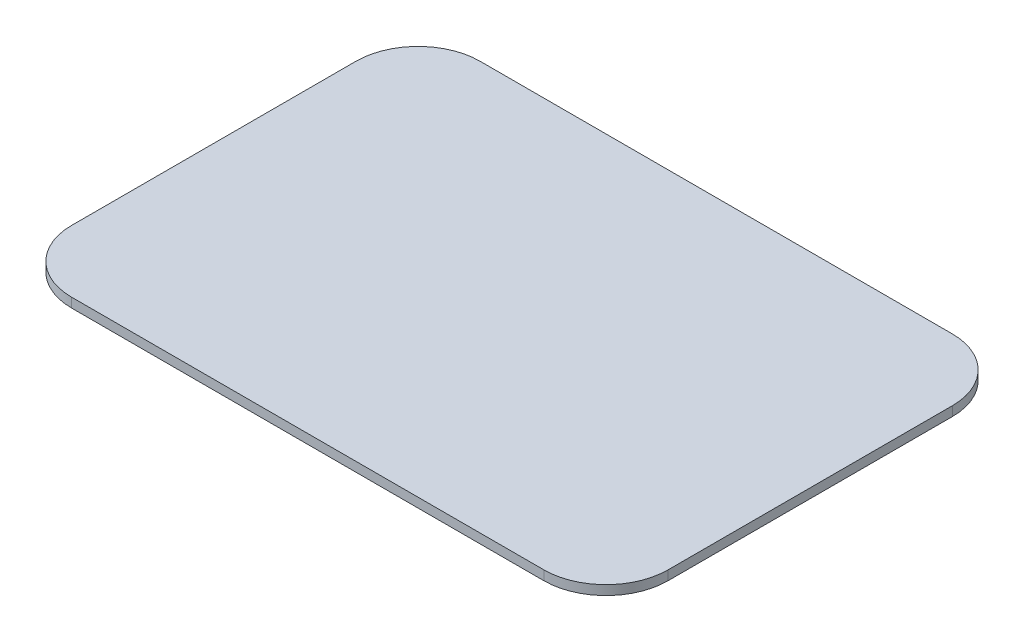
ISO-10303-21;
HEADER;
FILE_DESCRIPTION(('STEP AP214'),'2;1');
FILE_NAME('part.step','',(''),(''),'','','');
FILE_SCHEMA(('AUTOMOTIVE_DESIGN { 1 0 10303 214 1 1 1 1 }'));
ENDSEC;
DATA;
#1=APPLICATION_CONTEXT('core data for automotive mechanical design processes');
#2=APPLICATION_PROTOCOL_DEFINITION('international standard','automotive_design',2000,#1);
#3=PRODUCT_CONTEXT('',#1,'mechanical');
#4=PRODUCT('Part','Part','',(#3));
#5=PRODUCT_RELATED_PRODUCT_CATEGORY('part','',(#4));
#6=PRODUCT_DEFINITION_FORMATION('','',#4);
#7=PRODUCT_DEFINITION_CONTEXT('part definition',#1,'design');
#8=PRODUCT_DEFINITION('design','',#6,#7);
#9=PRODUCT_DEFINITION_SHAPE('','',#8);
#10=(LENGTH_UNIT() NAMED_UNIT(*) SI_UNIT(.MILLI.,.METRE.));
#11=(NAMED_UNIT(*) PLANE_ANGLE_UNIT() SI_UNIT($,.RADIAN.));
#12=(NAMED_UNIT(*) SI_UNIT($,.STERADIAN.) SOLID_ANGLE_UNIT());
#13=UNCERTAINTY_MEASURE_WITH_UNIT(LENGTH_MEASURE(1.E-05),#10,'distance_accuracy_value','');
#14=(GEOMETRIC_REPRESENTATION_CONTEXT(3) GLOBAL_UNCERTAINTY_ASSIGNED_CONTEXT((#13)) GLOBAL_UNIT_ASSIGNED_CONTEXT((#10,
#11,#12)) REPRESENTATION_CONTEXT('',''));
#15=CARTESIAN_POINT('',(0.,0.,0.));
#16=DIRECTION('',(0.,0.,1.));
#17=DIRECTION('',(1.,0.,0.));
#18=AXIS2_PLACEMENT_3D('',#15,#16,#17);
#19=CARTESIAN_POINT('',(-50.,2.,-30.1023013459279));
#20=DIRECTION('',(0.,-1.,0.));
#21=DIRECTION('',(0.,0.,-1.));
#22=AXIS2_PLACEMENT_3D('',#19,#20,#21);
#23=CYLINDRICAL_SURFACE('',#22,13.15);
#24=CARTESIAN_POINT('',(-50.,0.,-30.1023013459279));
#25=DIRECTION('',(0.,1.,0.));
#26=DIRECTION('',(0.,0.,1.));
#27=AXIS2_PLACEMENT_3D('',#24,#25,#26);
#28=CIRCLE('',#27,13.15);
#29=CARTESIAN_POINT('',(-50.,0.,-43.2523013459279));
#30=VERTEX_POINT('',#29);
#31=CARTESIAN_POINT('',(-63.15,0.,-30.1023013459279));
#32=VERTEX_POINT('',#31);
#33=EDGE_CURVE('E140',#30,#32,#28,.T.);
#34=ORIENTED_EDGE('',*,*,#33,.T.);
#35=DIRECTION('',(0.,-1.,0.));
#36=VECTOR('',#35,1.);
#37=CARTESIAN_POINT('',(-63.15,2.,-30.1023013459279));
#38=LINE('',#37,#36);
#39=CARTESIAN_POINT('',(-63.15,2.,-30.1023013459279));
#40=VERTEX_POINT('',#39);
#41=EDGE_CURVE('E11',#40,#32,#38,.T.);
#42=ORIENTED_EDGE('',*,*,#41,.F.);
#43=CARTESIAN_POINT('',(-50.,2.,-30.1023013459279));
#44=DIRECTION('',(0.,1.,0.));
#45=DIRECTION('',(0.,0.,1.));
#46=AXIS2_PLACEMENT_3D('',#43,#44,#45);
#47=CIRCLE('',#46,13.15);
#48=CARTESIAN_POINT('',(-50.,2.,-43.2523013459279));
#49=VERTEX_POINT('',#48);
#50=EDGE_CURVE('E162',#49,#40,#47,.T.);
#51=ORIENTED_EDGE('',*,*,#50,.F.);
#52=DIRECTION('',(0.,-1.,0.));
#53=VECTOR('',#52,1.);
#54=CARTESIAN_POINT('',(-50.,2.,-43.2523013459279));
#55=LINE('',#54,#53);
#56=EDGE_CURVE('E136',#49,#30,#55,.T.);
#57=ORIENTED_EDGE('',*,*,#56,.T.);
#58=EDGE_LOOP('',(#34,#42,#51,#57));
#59=FACE_BOUND('',#58,.T.);
#60=ADVANCED_FACE('F39',(#59),#23,.T.);
#61=CARTESIAN_POINT('',(-63.15,2.,-30.1023013459279));
#62=DIRECTION('',(1.,0.,0.));
#63=DIRECTION('',(0.,0.,-1.));
#64=AXIS2_PLACEMENT_3D('',#61,#62,#63);
#65=PLANE('',#64);
#66=DIRECTION('',(0.,0.,1.));
#67=VECTOR('',#66,1.);
#68=CARTESIAN_POINT('',(-63.15,0.,-30.1023013459279));
#69=LINE('',#68,#67);
#70=CARTESIAN_POINT('',(-63.15,0.,30.1023013459279));
#71=VERTEX_POINT('',#70);
#72=EDGE_CURVE('E144',#32,#71,#69,.T.);
#73=ORIENTED_EDGE('',*,*,#72,.T.);
#74=DIRECTION('',(0.,-1.,0.));
#75=VECTOR('',#74,1.);
#76=CARTESIAN_POINT('',(-63.15,2.,30.1023013459279));
#77=LINE('',#76,#75);
#78=CARTESIAN_POINT('',(-63.15,2.,30.1023013459279));
#79=VERTEX_POINT('',#78);
#80=EDGE_CURVE('E48',#79,#71,#77,.T.);
#81=ORIENTED_EDGE('',*,*,#80,.F.);
#82=DIRECTION('',(0.,0.,1.));
#83=VECTOR('',#82,1.);
#84=CARTESIAN_POINT('',(-63.15,2.,-30.1023013459279));
#85=LINE('',#84,#83);
#86=EDGE_CURVE('E99',#40,#79,#85,.T.);
#87=ORIENTED_EDGE('',*,*,#86,.F.);
#88=ORIENTED_EDGE('',*,*,#41,.T.);
#89=EDGE_LOOP('',(#73,#81,#87,#88));
#90=FACE_BOUND('',#89,.T.);
#91=ADVANCED_FACE('F208',(#90),#65,.F.);
#92=CARTESIAN_POINT('',(-50.,2.,30.1023013459279));
#93=DIRECTION('',(0.,-1.,0.));
#94=DIRECTION('',(0.,0.,-1.));
#95=AXIS2_PLACEMENT_3D('',#92,#93,#94);
#96=CYLINDRICAL_SURFACE('',#95,13.15);
#97=CARTESIAN_POINT('',(-50.,0.,30.1023013459279));
#98=DIRECTION('',(0.,1.,0.));
#99=DIRECTION('',(0.,0.,-1.));
#100=AXIS2_PLACEMENT_3D('',#97,#98,#99);
#101=CIRCLE('',#100,13.15);
#102=CARTESIAN_POINT('',(-50.,0.,43.2523013459279));
#103=VERTEX_POINT('',#102);
#104=EDGE_CURVE('E147',#71,#103,#101,.T.);
#105=ORIENTED_EDGE('',*,*,#104,.T.);
#106=DIRECTION('',(0.,-1.,0.));
#107=VECTOR('',#106,1.);
#108=CARTESIAN_POINT('',(-50.,2.,43.2523013459279));
#109=LINE('',#108,#107);
#110=CARTESIAN_POINT('',(-50.,2.,43.2523013459279));
#111=VERTEX_POINT('',#110);
#112=EDGE_CURVE('E173',#111,#103,#109,.T.);
#113=ORIENTED_EDGE('',*,*,#112,.F.);
#114=CARTESIAN_POINT('',(-50.,2.,30.1023013459279));
#115=DIRECTION('',(0.,1.,0.));
#116=DIRECTION('',(0.,0.,-1.));
#117=AXIS2_PLACEMENT_3D('',#114,#115,#116);
#118=CIRCLE('',#117,13.15);
#119=EDGE_CURVE('E183',#79,#111,#118,.T.);
#120=ORIENTED_EDGE('',*,*,#119,.F.);
#121=ORIENTED_EDGE('',*,*,#80,.T.);
#122=EDGE_LOOP('',(#105,#113,#120,#121));
#123=FACE_BOUND('',#122,.T.);
#124=ADVANCED_FACE('F181',(#123),#96,.T.);
#125=CARTESIAN_POINT('',(-50.,2.,43.2523013459279));
#126=DIRECTION('',(0.,0.,-1.));
#127=DIRECTION('',(-1.,0.,0.));
#128=AXIS2_PLACEMENT_3D('',#125,#126,#127);
#129=PLANE('',#128);
#130=DIRECTION('',(1.,0.,0.));
#131=VECTOR('',#130,1.);
#132=CARTESIAN_POINT('',(-50.,0.,43.2523013459279));
#133=LINE('',#132,#131);
#134=CARTESIAN_POINT('',(50.,0.,43.2523013459279));
#135=VERTEX_POINT('',#134);
#136=EDGE_CURVE('E150',#103,#135,#133,.T.);
#137=ORIENTED_EDGE('',*,*,#136,.T.);
#138=DIRECTION('',(0.,-1.,0.));
#139=VECTOR('',#138,1.);
#140=CARTESIAN_POINT('',(50.,2.,43.2523013459279));
#141=LINE('',#140,#139);
#142=CARTESIAN_POINT('',(50.,2.,43.2523013459279));
#143=VERTEX_POINT('',#142);
#144=EDGE_CURVE('E169',#143,#135,#141,.T.);
#145=ORIENTED_EDGE('',*,*,#144,.F.);
#146=DIRECTION('',(1.,0.,0.));
#147=VECTOR('',#146,1.);
#148=CARTESIAN_POINT('',(-50.,2.,43.2523013459279));
#149=LINE('',#148,#147);
#150=EDGE_CURVE('E196',#111,#143,#149,.T.);
#151=ORIENTED_EDGE('',*,*,#150,.F.);
#152=ORIENTED_EDGE('',*,*,#112,.T.);
#153=EDGE_LOOP('',(#137,#145,#151,#152));
#154=FACE_BOUND('',#153,.T.);
#155=ADVANCED_FACE('F191',(#154),#129,.F.);
#156=CARTESIAN_POINT('',(50.,2.,30.1023013459279));
#157=DIRECTION('',(0.,-1.,0.));
#158=DIRECTION('',(0.,0.,-1.));
#159=AXIS2_PLACEMENT_3D('',#156,#157,#158);
#160=CYLINDRICAL_SURFACE('',#159,13.15);
#161=CARTESIAN_POINT('',(50.,0.,30.1023013459279));
#162=DIRECTION('',(0.,1.,0.));
#163=DIRECTION('',(0.,0.,1.));
#164=AXIS2_PLACEMENT_3D('',#161,#162,#163);
#165=CIRCLE('',#164,13.15);
#166=CARTESIAN_POINT('',(63.15,0.,30.1023013459279));
#167=VERTEX_POINT('',#166);
#168=EDGE_CURVE('E153',#135,#167,#165,.T.);
#169=ORIENTED_EDGE('',*,*,#168,.T.);
#170=DIRECTION('',(0.,-1.,0.));
#171=VECTOR('',#170,1.);
#172=CARTESIAN_POINT('',(63.15,2.,30.1023013459279));
#173=LINE('',#172,#171);
#174=CARTESIAN_POINT('',(63.15,2.,30.1023013459279));
#175=VERTEX_POINT('',#174);
#176=EDGE_CURVE('E129',#175,#167,#173,.T.);
#177=ORIENTED_EDGE('',*,*,#176,.F.);
#178=CARTESIAN_POINT('',(50.,2.,30.1023013459279));
#179=DIRECTION('',(0.,1.,0.));
#180=DIRECTION('',(0.,0.,1.));
#181=AXIS2_PLACEMENT_3D('',#178,#179,#180);
#182=CIRCLE('',#181,13.15);
#183=EDGE_CURVE('E118',#143,#175,#182,.T.);
#184=ORIENTED_EDGE('',*,*,#183,.F.);
#185=ORIENTED_EDGE('',*,*,#144,.T.);
#186=EDGE_LOOP('',(#169,#177,#184,#185));
#187=FACE_BOUND('',#186,.T.);
#188=ADVANCED_FACE('F194',(#187),#160,.T.);
#189=CARTESIAN_POINT('',(63.15,2.,-30.1023013459279));
#190=DIRECTION('',(-1.,0.,0.));
#191=DIRECTION('',(0.,0.,1.));
#192=AXIS2_PLACEMENT_3D('',#189,#190,#191);
#193=PLANE('',#192);
#194=DIRECTION('',(0.,0.,-1.));
#195=VECTOR('',#194,1.);
#196=CARTESIAN_POINT('',(63.15,0.,-30.1023013459279));
#197=LINE('',#196,#195);
#198=CARTESIAN_POINT('',(63.15,0.,-30.1023013459279));
#199=VERTEX_POINT('',#198);
#200=EDGE_CURVE('E127',#167,#199,#197,.T.);
#201=ORIENTED_EDGE('',*,*,#200,.T.);
#202=DIRECTION('',(0.,-1.,0.));
#203=VECTOR('',#202,1.);
#204=CARTESIAN_POINT('',(63.15,2.,-30.1023013459279));
#205=LINE('',#204,#203);
#206=CARTESIAN_POINT('',(63.15,2.,-30.1023013459279));
#207=VERTEX_POINT('',#206);
#208=EDGE_CURVE('E124',#207,#199,#205,.T.);
#209=ORIENTED_EDGE('',*,*,#208,.F.);
#210=DIRECTION('',(0.,0.,-1.));
#211=VECTOR('',#210,1.);
#212=CARTESIAN_POINT('',(63.15,2.,-30.1023013459279));
#213=LINE('',#212,#211);
#214=EDGE_CURVE('E112',#175,#207,#213,.T.);
#215=ORIENTED_EDGE('',*,*,#214,.F.);
#216=ORIENTED_EDGE('',*,*,#176,.T.);
#217=EDGE_LOOP('',(#201,#209,#215,#216));
#218=FACE_BOUND('',#217,.T.);
#219=ADVANCED_FACE('F125',(#218),#193,.F.);
#220=CARTESIAN_POINT('',(50.,2.,-30.1023013459279));
#221=DIRECTION('',(0.,-1.,0.));
#222=DIRECTION('',(0.,0.,-1.));
#223=AXIS2_PLACEMENT_3D('',#220,#221,#222);
#224=CYLINDRICAL_SURFACE('',#223,13.15);
#225=CARTESIAN_POINT('',(50.,0.,-30.1023013459279));
#226=DIRECTION('',(0.,1.,0.));
#227=DIRECTION('',(0.,0.,-1.));
#228=AXIS2_PLACEMENT_3D('',#225,#226,#227);
#229=CIRCLE('',#228,13.15);
#230=CARTESIAN_POINT('',(50.,0.,-43.2523013459279));
#231=VERTEX_POINT('',#230);
#232=EDGE_CURVE('E85',#199,#231,#229,.T.);
#233=ORIENTED_EDGE('',*,*,#232,.T.);
#234=DIRECTION('',(0.,-1.,0.));
#235=VECTOR('',#234,1.);
#236=CARTESIAN_POINT('',(50.,2.,-43.2523013459279));
#237=LINE('',#236,#235);
#238=CARTESIAN_POINT('',(50.,2.,-43.2523013459279));
#239=VERTEX_POINT('',#238);
#240=EDGE_CURVE('E130',#239,#231,#237,.T.);
#241=ORIENTED_EDGE('',*,*,#240,.F.);
#242=CARTESIAN_POINT('',(50.,2.,-30.1023013459279));
#243=DIRECTION('',(0.,1.,0.));
#244=DIRECTION('',(0.,0.,-1.));
#245=AXIS2_PLACEMENT_3D('',#242,#243,#244);
#246=CIRCLE('',#245,13.15);
#247=EDGE_CURVE('E116',#207,#239,#246,.T.);
#248=ORIENTED_EDGE('',*,*,#247,.F.);
#249=ORIENTED_EDGE('',*,*,#208,.T.);
#250=EDGE_LOOP('',(#233,#241,#248,#249));
#251=FACE_BOUND('',#250,.T.);
#252=ADVANCED_FACE('F132',(#251),#224,.T.);
#253=CARTESIAN_POINT('',(-50.,2.,-43.2523013459279));
#254=DIRECTION('',(0.,0.,1.));
#255=DIRECTION('',(1.,0.,0.));
#256=AXIS2_PLACEMENT_3D('',#253,#254,#255);
#257=PLANE('',#256);
#258=DIRECTION('',(-1.,0.,0.));
#259=VECTOR('',#258,1.);
#260=CARTESIAN_POINT('',(-50.,0.,-43.2523013459279));
#261=LINE('',#260,#259);
#262=EDGE_CURVE('E91',#231,#30,#261,.T.);
#263=ORIENTED_EDGE('',*,*,#262,.T.);
#264=ORIENTED_EDGE('',*,*,#56,.F.);
#265=DIRECTION('',(-1.,0.,0.));
#266=VECTOR('',#265,1.);
#267=CARTESIAN_POINT('',(-50.,2.,-43.2523013459279));
#268=LINE('',#267,#266);
#269=EDGE_CURVE('E56',#239,#49,#268,.T.);
#270=ORIENTED_EDGE('',*,*,#269,.F.);
#271=ORIENTED_EDGE('',*,*,#240,.T.);
#272=EDGE_LOOP('',(#263,#264,#270,#271));
#273=FACE_BOUND('',#272,.T.);
#274=ADVANCED_FACE('F224',(#273),#257,.F.);
#275=CARTESIAN_POINT('',(-50.,2.,-30.1023013459279));
#276=DIRECTION('',(0.,1.,0.));
#277=DIRECTION('',(0.,0.,1.));
#278=AXIS2_PLACEMENT_3D('',#275,#276,#277);
#279=PLANE('',#278);
#280=ORIENTED_EDGE('',*,*,#50,.T.);
#281=ORIENTED_EDGE('',*,*,#86,.T.);
#282=ORIENTED_EDGE('',*,*,#119,.T.);
#283=ORIENTED_EDGE('',*,*,#150,.T.);
#284=ORIENTED_EDGE('',*,*,#183,.T.);
#285=ORIENTED_EDGE('',*,*,#214,.T.);
#286=ORIENTED_EDGE('',*,*,#247,.T.);
#287=ORIENTED_EDGE('',*,*,#269,.T.);
#288=EDGE_LOOP('',(#280,#281,#282,#283,#284,#285,#286,#287));
#289=FACE_BOUND('',#288,.T.);
#290=ADVANCED_FACE('F114',(#289),#279,.T.);
#291=CARTESIAN_POINT('',(-50.,0.,-30.1023013459279));
#292=DIRECTION('',(0.,1.,0.));
#293=DIRECTION('',(0.,0.,1.));
#294=AXIS2_PLACEMENT_3D('',#291,#292,#293);
#295=PLANE('',#294);
#296=ORIENTED_EDGE('',*,*,#33,.F.);
#297=ORIENTED_EDGE('',*,*,#262,.F.);
#298=ORIENTED_EDGE('',*,*,#232,.F.);
#299=ORIENTED_EDGE('',*,*,#200,.F.);
#300=ORIENTED_EDGE('',*,*,#168,.F.);
#301=ORIENTED_EDGE('',*,*,#136,.F.);
#302=ORIENTED_EDGE('',*,*,#104,.F.);
#303=ORIENTED_EDGE('',*,*,#72,.F.);
#304=EDGE_LOOP('',(#296,#297,#298,#299,#300,#301,#302,#303));
#305=FACE_BOUND('',#304,.T.);
#306=ADVANCED_FACE('F187',(#305),#295,.F.);
#307=CLOSED_SHELL('',(#60,#91,#124,#155,#188,#219,#252,#274,#290,#306));
#308=MANIFOLD_SOLID_BREP('B2',#307);
#309=ADVANCED_BREP_SHAPE_REPRESENTATION('',(#18,#308),#14);
#310=SHAPE_DEFINITION_REPRESENTATION(#9,#309);
ENDSEC;
END-ISO-10303-21;
